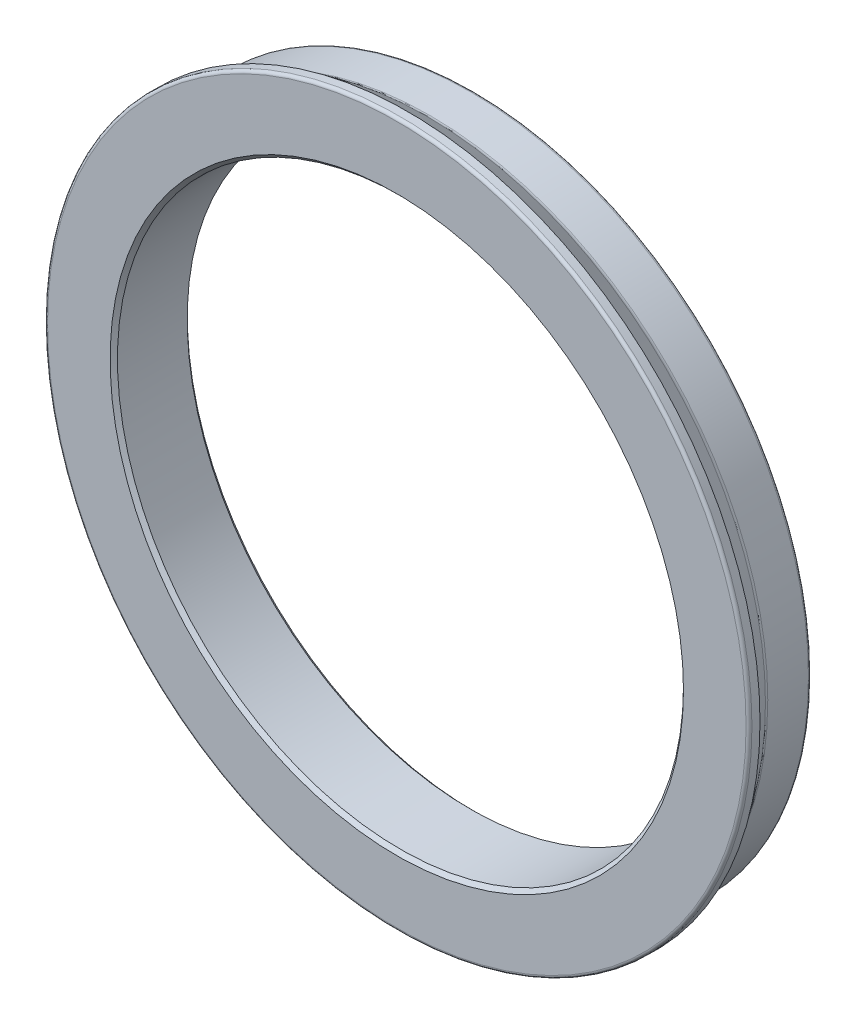
ISO-10303-21;
HEADER;
FILE_DESCRIPTION(('STEP AP214'),'2;1');
FILE_NAME('part.step','',(''),(''),'','','');
FILE_SCHEMA(('AUTOMOTIVE_DESIGN { 1 0 10303 214 1 1 1 1 }'));
ENDSEC;
DATA;
#1=APPLICATION_CONTEXT('core data for automotive mechanical design processes');
#2=APPLICATION_PROTOCOL_DEFINITION('international standard','automotive_design',2000,#1);
#3=PRODUCT_CONTEXT('',#1,'mechanical');
#4=PRODUCT('Part','Part','',(#3));
#5=PRODUCT_RELATED_PRODUCT_CATEGORY('part','',(#4));
#6=PRODUCT_DEFINITION_FORMATION('','',#4);
#7=PRODUCT_DEFINITION_CONTEXT('part definition',#1,'design');
#8=PRODUCT_DEFINITION('design','',#6,#7);
#9=PRODUCT_DEFINITION_SHAPE('','',#8);
#10=(LENGTH_UNIT() NAMED_UNIT(*) SI_UNIT(.MILLI.,.METRE.));
#11=(NAMED_UNIT(*) PLANE_ANGLE_UNIT() SI_UNIT($,.RADIAN.));
#12=(NAMED_UNIT(*) SI_UNIT($,.STERADIAN.) SOLID_ANGLE_UNIT());
#13=UNCERTAINTY_MEASURE_WITH_UNIT(LENGTH_MEASURE(1.E-05),#10,'distance_accuracy_value','');
#14=(GEOMETRIC_REPRESENTATION_CONTEXT(3) GLOBAL_UNCERTAINTY_ASSIGNED_CONTEXT((#13)) GLOBAL_UNIT_ASSIGNED_CONTEXT((#10,
#11,#12)) REPRESENTATION_CONTEXT('',''));
#15=CARTESIAN_POINT('',(0.,0.,0.));
#16=DIRECTION('',(0.,0.,1.));
#17=DIRECTION('',(1.,0.,0.));
#18=AXIS2_PLACEMENT_3D('',#15,#16,#17);
#19=CARTESIAN_POINT('',(0.,0.,-0.4));
#20=DIRECTION('',(0.,0.,1.));
#21=DIRECTION('',(1.,0.,0.));
#22=AXIS2_PLACEMENT_3D('',#19,#20,#21);
#23=TOROIDAL_SURFACE('',#22,47.575,0.399999999999999);
#24=CARTESIAN_POINT('',(0.,0.,0.));
#25=DIRECTION('',(0.,0.,1.));
#26=DIRECTION('',(1.,0.,0.));
#27=AXIS2_PLACEMENT_3D('',#24,#25,#26);
#28=CIRCLE('',#27,47.575);
#29=CARTESIAN_POINT('',(47.575,0.,0.));
#30=VERTEX_POINT('',#29);
#31=EDGE_CURVE('E76',#30,#30,#28,.T.);
#32=ORIENTED_EDGE('',*,*,#31,.F.);
#33=EDGE_LOOP('',(#32));
#34=FACE_BOUND('',#33,.T.);
#35=CARTESIAN_POINT('',(0.,0.,-0.4));
#36=DIRECTION('',(0.,0.,1.));
#37=DIRECTION('',(1.,0.,0.));
#38=AXIS2_PLACEMENT_3D('',#35,#36,#37);
#39=CIRCLE('',#38,47.975);
#40=CARTESIAN_POINT('',(47.975,0.,-0.4));
#41=VERTEX_POINT('',#40);
#42=EDGE_CURVE('E10',#41,#41,#39,.T.);
#43=ORIENTED_EDGE('',*,*,#42,.T.);
#44=EDGE_LOOP('',(#43));
#45=FACE_BOUND('',#44,.T.);
#46=ADVANCED_FACE('F39',(#34,#45),#23,.T.);
#47=CARTESIAN_POINT('',(0.,0.,0.));
#48=DIRECTION('',(0.,0.,1.));
#49=DIRECTION('',(1.,0.,0.));
#50=AXIS2_PLACEMENT_3D('',#47,#48,#49);
#51=CYLINDRICAL_SURFACE('',#50,47.975);
#52=ORIENTED_EDGE('',*,*,#42,.F.);
#53=EDGE_LOOP('',(#52));
#54=FACE_BOUND('',#53,.T.);
#55=CARTESIAN_POINT('',(0.,0.,-1.5));
#56=DIRECTION('',(0.,0.,1.));
#57=DIRECTION('',(1.,0.,0.));
#58=AXIS2_PLACEMENT_3D('',#55,#56,#57);
#59=CIRCLE('',#58,47.975);
#60=CARTESIAN_POINT('',(47.975,0.,-1.5));
#61=VERTEX_POINT('',#60);
#62=EDGE_CURVE('E45',#61,#61,#59,.T.);
#63=ORIENTED_EDGE('',*,*,#62,.T.);
#64=EDGE_LOOP('',(#63));
#65=FACE_BOUND('',#64,.T.);
#66=ADVANCED_FACE('F83',(#54,#65),#51,.T.);
#67=CARTESIAN_POINT('',(0.,0.,-4.09138148775154));
#68=DIRECTION('',(0.,0.,1.));
#69=DIRECTION('',(1.,0.,0.));
#70=AXIS2_PLACEMENT_3D('',#67,#68,#69);
#71=CONICAL_SURFACE('',#70,46.1240132230346,0.620249485982822);
#72=ORIENTED_EDGE('',*,*,#62,.F.);
#73=EDGE_LOOP('',(#72));
#74=FACE_BOUND('',#73,.T.);
#75=CARTESIAN_POINT('',(0.,0.,-4.09138148775154));
#76=DIRECTION('',(0.,0.,1.));
#77=DIRECTION('',(1.,0.,0.));
#78=AXIS2_PLACEMENT_3D('',#75,#76,#77);
#79=CIRCLE('',#78,46.1240132230346);
#80=CARTESIAN_POINT('',(46.1240132230346,0.,-4.09138148775154));
#81=VERTEX_POINT('',#80);
#82=EDGE_CURVE('E49',#81,#81,#79,.T.);
#83=ORIENTED_EDGE('',*,*,#82,.T.);
#84=EDGE_LOOP('',(#83));
#85=FACE_BOUND('',#84,.T.);
#86=ADVANCED_FACE('F87',(#74,#85),#71,.T.);
#87=CARTESIAN_POINT('',(0.,0.,-4.55637204272682));
#88=DIRECTION('',(0.,0.,1.));
#89=DIRECTION('',(1.,0.,0.));
#90=AXIS2_PLACEMENT_3D('',#87,#88,#89);
#91=TOROIDAL_SURFACE('',#90,46.775,0.800000000000001);
#92=ORIENTED_EDGE('',*,*,#82,.F.);
#93=EDGE_LOOP('',(#92));
#94=FACE_BOUND('',#93,.T.);
#95=CARTESIAN_POINT('',(0.,0.,-4.55637204272682));
#96=DIRECTION('',(0.,0.,1.));
#97=DIRECTION('',(1.,0.,0.));
#98=AXIS2_PLACEMENT_3D('',#95,#96,#97);
#99=CIRCLE('',#98,45.975);
#100=CARTESIAN_POINT('',(45.975,0.,-4.55637204272682));
#101=VERTEX_POINT('',#100);
#102=EDGE_CURVE('E53',#101,#101,#99,.T.);
#103=ORIENTED_EDGE('',*,*,#102,.T.);
#104=EDGE_LOOP('',(#103));
#105=FACE_BOUND('',#104,.T.);
#106=ADVANCED_FACE('F92',(#94,#105),#91,.F.);
#107=CARTESIAN_POINT('',(0.,0.,0.));
#108=DIRECTION('',(0.,0.,1.));
#109=DIRECTION('',(1.,0.,0.));
#110=AXIS2_PLACEMENT_3D('',#107,#108,#109);
#111=CYLINDRICAL_SURFACE('',#110,45.975);
#112=ORIENTED_EDGE('',*,*,#102,.F.);
#113=EDGE_LOOP('',(#112));
#114=FACE_BOUND('',#113,.T.);
#115=CARTESIAN_POINT('',(0.,0.,-10.1));
#116=DIRECTION('',(0.,0.,1.));
#117=DIRECTION('',(1.,0.,0.));
#118=AXIS2_PLACEMENT_3D('',#115,#116,#117);
#119=CIRCLE('',#118,45.975);
#120=CARTESIAN_POINT('',(45.975,0.,-10.1));
#121=VERTEX_POINT('',#120);
#122=EDGE_CURVE('E58',#121,#121,#119,.T.);
#123=ORIENTED_EDGE('',*,*,#122,.T.);
#124=EDGE_LOOP('',(#123));
#125=FACE_BOUND('',#124,.T.);
#126=ADVANCED_FACE('F98',(#114,#125),#111,.T.);
#127=CARTESIAN_POINT('',(0.,0.,-10.1));
#128=DIRECTION('',(0.,0.,1.));
#129=DIRECTION('',(1.,0.,0.));
#130=AXIS2_PLACEMENT_3D('',#127,#128,#129);
#131=TOROIDAL_SURFACE('',#130,45.575,0.399999999999998);
#132=ORIENTED_EDGE('',*,*,#122,.F.);
#133=EDGE_LOOP('',(#132));
#134=FACE_BOUND('',#133,.T.);
#135=CARTESIAN_POINT('',(0.,0.,-10.5));
#136=DIRECTION('',(0.,0.,1.));
#137=DIRECTION('',(1.,0.,0.));
#138=AXIS2_PLACEMENT_3D('',#135,#136,#137);
#139=CIRCLE('',#138,45.575);
#140=CARTESIAN_POINT('',(45.575,0.,-10.5));
#141=VERTEX_POINT('',#140);
#142=EDGE_CURVE('E61',#141,#141,#139,.T.);
#143=ORIENTED_EDGE('',*,*,#142,.T.);
#144=EDGE_LOOP('',(#143));
#145=FACE_BOUND('',#144,.T.);
#146=ADVANCED_FACE('F102',(#134,#145),#131,.T.);
#147=CARTESIAN_POINT('',(0.,45.575,-10.5));
#148=DIRECTION('',(0.,0.,1.));
#149=DIRECTION('',(1.,0.,0.));
#150=AXIS2_PLACEMENT_3D('',#147,#148,#149);
#151=PLANE('',#150);
#152=ORIENTED_EDGE('',*,*,#142,.F.);
#153=EDGE_LOOP('',(#152));
#154=FACE_BOUND('',#153,.T.);
#155=CARTESIAN_POINT('',(0.,0.,-10.5));
#156=DIRECTION('',(0.,0.,1.));
#157=DIRECTION('',(1.,0.,0.));
#158=AXIS2_PLACEMENT_3D('',#155,#156,#157);
#159=CIRCLE('',#158,39.05);
#160=CARTESIAN_POINT('',(39.05,0.,-10.5));
#161=VERTEX_POINT('',#160);
#162=EDGE_CURVE('E64',#161,#161,#159,.T.);
#163=ORIENTED_EDGE('',*,*,#162,.T.);
#164=EDGE_LOOP('',(#163));
#165=FACE_BOUND('',#164,.T.);
#166=ADVANCED_FACE('F106',(#154,#165),#151,.F.);
#167=CARTESIAN_POINT('',(0.,0.,-10.));
#168=DIRECTION('',(0.,0.,-1.));
#169=DIRECTION('',(-1.,0.,0.));
#170=AXIS2_PLACEMENT_3D('',#167,#168,#169);
#171=CONICAL_SURFACE('',#170,38.55,0.785398163397447);
#172=ORIENTED_EDGE('',*,*,#162,.F.);
#173=EDGE_LOOP('',(#172));
#174=FACE_BOUND('',#173,.T.);
#175=CARTESIAN_POINT('',(0.,0.,-10.));
#176=DIRECTION('',(0.,0.,1.));
#177=DIRECTION('',(1.,0.,0.));
#178=AXIS2_PLACEMENT_3D('',#175,#176,#177);
#179=CIRCLE('',#178,38.55);
#180=CARTESIAN_POINT('',(38.55,0.,-10.));
#181=VERTEX_POINT('',#180);
#182=EDGE_CURVE('E67',#181,#181,#179,.T.);
#183=ORIENTED_EDGE('',*,*,#182,.T.);
#184=EDGE_LOOP('',(#183));
#185=FACE_BOUND('',#184,.T.);
#186=ADVANCED_FACE('F110',(#174,#185),#171,.F.);
#187=CARTESIAN_POINT('',(0.,0.,0.));
#188=DIRECTION('',(0.,0.,1.));
#189=DIRECTION('',(1.,0.,0.));
#190=AXIS2_PLACEMENT_3D('',#187,#188,#189);
#191=CYLINDRICAL_SURFACE('',#190,38.55);
#192=ORIENTED_EDGE('',*,*,#182,.F.);
#193=EDGE_LOOP('',(#192));
#194=FACE_BOUND('',#193,.T.);
#195=CARTESIAN_POINT('',(0.,0.,-0.500000000000001));
#196=DIRECTION('',(0.,0.,1.));
#197=DIRECTION('',(1.,0.,0.));
#198=AXIS2_PLACEMENT_3D('',#195,#196,#197);
#199=CIRCLE('',#198,38.55);
#200=CARTESIAN_POINT('',(38.55,0.,-0.500000000000001));
#201=VERTEX_POINT('',#200);
#202=EDGE_CURVE('E70',#201,#201,#199,.T.);
#203=ORIENTED_EDGE('',*,*,#202,.T.);
#204=EDGE_LOOP('',(#203));
#205=FACE_BOUND('',#204,.T.);
#206=ADVANCED_FACE('F114',(#194,#205),#191,.F.);
#207=CARTESIAN_POINT('',(0.,0.,0.));
#208=DIRECTION('',(0.,0.,1.));
#209=DIRECTION('',(1.,0.,0.));
#210=AXIS2_PLACEMENT_3D('',#207,#208,#209);
#211=CONICAL_SURFACE('',#210,39.05,0.785398163397449);
#212=ORIENTED_EDGE('',*,*,#202,.F.);
#213=EDGE_LOOP('',(#212));
#214=FACE_BOUND('',#213,.T.);
#215=CARTESIAN_POINT('',(0.,0.,0.));
#216=DIRECTION('',(0.,0.,1.));
#217=DIRECTION('',(1.,0.,0.));
#218=AXIS2_PLACEMENT_3D('',#215,#216,#217);
#219=CIRCLE('',#218,39.05);
#220=CARTESIAN_POINT('',(39.05,0.,0.));
#221=VERTEX_POINT('',#220);
#222=EDGE_CURVE('E73',#221,#221,#219,.T.);
#223=ORIENTED_EDGE('',*,*,#222,.T.);
#224=EDGE_LOOP('',(#223));
#225=FACE_BOUND('',#224,.T.);
#226=ADVANCED_FACE('F118',(#214,#225),#211,.F.);
#227=CARTESIAN_POINT('',(0.,47.575,0.));
#228=DIRECTION('',(0.,0.,-1.));
#229=DIRECTION('',(-1.,0.,0.));
#230=AXIS2_PLACEMENT_3D('',#227,#228,#229);
#231=PLANE('',#230);
#232=ORIENTED_EDGE('',*,*,#222,.F.);
#233=EDGE_LOOP('',(#232));
#234=FACE_BOUND('',#233,.T.);
#235=ORIENTED_EDGE('',*,*,#31,.T.);
#236=EDGE_LOOP('',(#235));
#237=FACE_BOUND('',#236,.T.);
#238=ADVANCED_FACE('F80',(#234,#237),#231,.F.);
#239=CLOSED_SHELL('',(#46,#66,#86,#106,#126,#146,#166,#186,#206,#226,#238));
#240=MANIFOLD_SOLID_BREP('B2',#239);
#241=ADVANCED_BREP_SHAPE_REPRESENTATION('',(#18,#240),#14);
#242=SHAPE_DEFINITION_REPRESENTATION(#9,#241);
ENDSEC;
END-ISO-10303-21;
